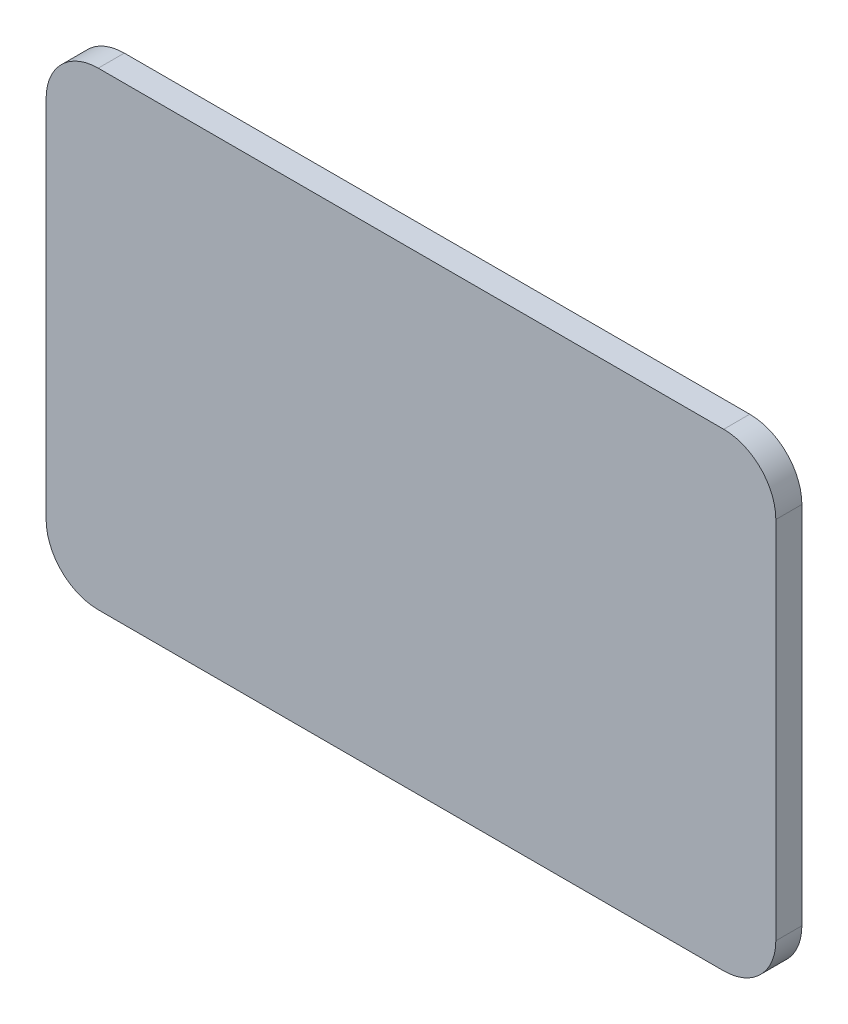
ISO-10303-21;
HEADER;
FILE_DESCRIPTION(('STEP AP214'),'2;1');
FILE_NAME('part.step','',(''),(''),'','','');
FILE_SCHEMA(('AUTOMOTIVE_DESIGN { 1 0 10303 214 1 1 1 1 }'));
ENDSEC;
DATA;
#1=APPLICATION_CONTEXT('core data for automotive mechanical design processes');
#2=APPLICATION_PROTOCOL_DEFINITION('international standard','automotive_design',2000,#1);
#3=PRODUCT_CONTEXT('',#1,'mechanical');
#4=PRODUCT('Part','Part','',(#3));
#5=PRODUCT_RELATED_PRODUCT_CATEGORY('part','',(#4));
#6=PRODUCT_DEFINITION_FORMATION('','',#4);
#7=PRODUCT_DEFINITION_CONTEXT('part definition',#1,'design');
#8=PRODUCT_DEFINITION('design','',#6,#7);
#9=PRODUCT_DEFINITION_SHAPE('','',#8);
#10=(LENGTH_UNIT() NAMED_UNIT(*) SI_UNIT(.MILLI.,.METRE.));
#11=(NAMED_UNIT(*) PLANE_ANGLE_UNIT() SI_UNIT($,.RADIAN.));
#12=(NAMED_UNIT(*) SI_UNIT($,.STERADIAN.) SOLID_ANGLE_UNIT());
#13=UNCERTAINTY_MEASURE_WITH_UNIT(LENGTH_MEASURE(1.E-05),#10,'distance_accuracy_value','');
#14=(GEOMETRIC_REPRESENTATION_CONTEXT(3) GLOBAL_UNCERTAINTY_ASSIGNED_CONTEXT((#13)) GLOBAL_UNIT_ASSIGNED_CONTEXT((#10,
#11,#12)) REPRESENTATION_CONTEXT('',''));
#15=CARTESIAN_POINT('',(0.,0.,0.));
#16=DIRECTION('',(0.,0.,1.));
#17=DIRECTION('',(1.,0.,0.));
#18=AXIS2_PLACEMENT_3D('',#15,#16,#17);
#19=CARTESIAN_POINT('',(-11.3372745805237,-6.87857142857142,1.));
#20=DIRECTION('',(0.,0.,-1.));
#21=DIRECTION('',(-1.,0.,0.));
#22=AXIS2_PLACEMENT_3D('',#19,#20,#21);
#23=CYLINDRICAL_SURFACE('',#22,2.);
#24=CARTESIAN_POINT('',(-11.3372745805237,-6.87857142857142,0.));
#25=DIRECTION('',(0.,0.,1.));
#26=DIRECTION('',(1.,0.,0.));
#27=AXIS2_PLACEMENT_3D('',#24,#25,#26);
#28=CIRCLE('',#27,2.);
#29=CARTESIAN_POINT('',(-13.3372745805237,-6.87857142857141,0.));
#30=VERTEX_POINT('',#29);
#31=CARTESIAN_POINT('',(-11.3372745805237,-8.87857142857142,0.));
#32=VERTEX_POINT('',#31);
#33=EDGE_CURVE('E135',#30,#32,#28,.T.);
#34=ORIENTED_EDGE('',*,*,#33,.T.);
#35=DIRECTION('',(0.,0.,-1.));
#36=VECTOR('',#35,1.);
#37=CARTESIAN_POINT('',(-11.3372745805237,-8.87857142857142,1.));
#38=LINE('',#37,#36);
#39=CARTESIAN_POINT('',(-11.3372745805237,-8.87857142857142,1.));
#40=VERTEX_POINT('',#39);
#41=EDGE_CURVE('E11',#40,#32,#38,.T.);
#42=ORIENTED_EDGE('',*,*,#41,.F.);
#43=CARTESIAN_POINT('',(-11.3372745805237,-6.87857142857142,1.));
#44=DIRECTION('',(0.,0.,1.));
#45=DIRECTION('',(1.,0.,0.));
#46=AXIS2_PLACEMENT_3D('',#43,#44,#45);
#47=CIRCLE('',#46,2.);
#48=CARTESIAN_POINT('',(-13.3372745805237,-6.87857142857141,1.));
#49=VERTEX_POINT('',#48);
#50=EDGE_CURVE('E149',#49,#40,#47,.T.);
#51=ORIENTED_EDGE('',*,*,#50,.F.);
#52=DIRECTION('',(0.,0.,-1.));
#53=VECTOR('',#52,1.);
#54=CARTESIAN_POINT('',(-13.3372745805237,-6.87857142857141,1.));
#55=LINE('',#54,#53);
#56=EDGE_CURVE('E131',#49,#30,#55,.T.);
#57=ORIENTED_EDGE('',*,*,#56,.T.);
#58=EDGE_LOOP('',(#34,#42,#51,#57));
#59=FACE_BOUND('',#58,.T.);
#60=ADVANCED_FACE('F39',(#59),#23,.T.);
#61=CARTESIAN_POINT('',(-11.3372745805237,-8.87857142857142,1.));
#62=DIRECTION('',(0.,1.,0.));
#63=DIRECTION('',(0.,0.,1.));
#64=AXIS2_PLACEMENT_3D('',#61,#62,#63);
#65=PLANE('',#64);
#66=DIRECTION('',(1.,0.,0.));
#67=VECTOR('',#66,1.);
#68=CARTESIAN_POINT('',(-11.3372745805237,-8.87857142857142,0.));
#69=LINE('',#68,#67);
#70=CARTESIAN_POINT('',(12.6627254194763,-8.87857142857142,0.));
#71=VERTEX_POINT('',#70);
#72=EDGE_CURVE('E138',#32,#71,#69,.T.);
#73=ORIENTED_EDGE('',*,*,#72,.T.);
#74=DIRECTION('',(0.,0.,-1.));
#75=VECTOR('',#74,1.);
#76=CARTESIAN_POINT('',(12.6627254194763,-8.87857142857142,1.));
#77=LINE('',#76,#75);
#78=CARTESIAN_POINT('',(12.6627254194763,-8.87857142857142,1.));
#79=VERTEX_POINT('',#78);
#80=EDGE_CURVE('E47',#79,#71,#77,.T.);
#81=ORIENTED_EDGE('',*,*,#80,.F.);
#82=DIRECTION('',(1.,0.,0.));
#83=VECTOR('',#82,1.);
#84=CARTESIAN_POINT('',(-11.3372745805237,-8.87857142857142,1.));
#85=LINE('',#84,#83);
#86=EDGE_CURVE('E98',#40,#79,#85,.T.);
#87=ORIENTED_EDGE('',*,*,#86,.F.);
#88=ORIENTED_EDGE('',*,*,#41,.T.);
#89=EDGE_LOOP('',(#73,#81,#87,#88));
#90=FACE_BOUND('',#89,.T.);
#91=ADVANCED_FACE('F184',(#90),#65,.F.);
#92=CARTESIAN_POINT('',(12.6627254194763,-6.87857142857142,1.));
#93=DIRECTION('',(0.,0.,-1.));
#94=DIRECTION('',(-1.,0.,0.));
#95=AXIS2_PLACEMENT_3D('',#92,#93,#94);
#96=CYLINDRICAL_SURFACE('',#95,2.);
#97=CARTESIAN_POINT('',(12.6627254194763,-6.87857142857142,0.));
#98=DIRECTION('',(0.,0.,1.));
#99=DIRECTION('',(1.,0.,0.));
#100=AXIS2_PLACEMENT_3D('',#97,#98,#99);
#101=CIRCLE('',#100,2.);
#102=CARTESIAN_POINT('',(14.6627254194763,-6.87857142857142,0.));
#103=VERTEX_POINT('',#102);
#104=EDGE_CURVE('E140',#71,#103,#101,.T.);
#105=ORIENTED_EDGE('',*,*,#104,.T.);
#106=DIRECTION('',(0.,0.,-1.));
#107=VECTOR('',#106,1.);
#108=CARTESIAN_POINT('',(14.6627254194763,-6.87857142857142,1.));
#109=LINE('',#108,#107);
#110=CARTESIAN_POINT('',(14.6627254194763,-6.87857142857142,1.));
#111=VERTEX_POINT('',#110);
#112=EDGE_CURVE('E156',#111,#103,#109,.T.);
#113=ORIENTED_EDGE('',*,*,#112,.F.);
#114=CARTESIAN_POINT('',(12.6627254194763,-6.87857142857142,1.));
#115=DIRECTION('',(0.,0.,1.));
#116=DIRECTION('',(1.,0.,0.));
#117=AXIS2_PLACEMENT_3D('',#114,#115,#116);
#118=CIRCLE('',#117,2.);
#119=EDGE_CURVE('E164',#79,#111,#118,.T.);
#120=ORIENTED_EDGE('',*,*,#119,.F.);
#121=ORIENTED_EDGE('',*,*,#80,.T.);
#122=EDGE_LOOP('',(#105,#113,#120,#121));
#123=FACE_BOUND('',#122,.T.);
#124=ADVANCED_FACE('F162',(#123),#96,.T.);
#125=CARTESIAN_POINT('',(14.6627254194763,-6.87857142857142,1.));
#126=DIRECTION('',(-1.,0.,0.));
#127=DIRECTION('',(0.,0.,1.));
#128=AXIS2_PLACEMENT_3D('',#125,#126,#127);
#129=PLANE('',#128);
#130=DIRECTION('',(0.,1.,0.));
#131=VECTOR('',#130,1.);
#132=CARTESIAN_POINT('',(14.6627254194763,-6.87857142857142,0.));
#133=LINE('',#132,#131);
#134=CARTESIAN_POINT('',(14.6627254194763,7.12142857142856,0.));
#135=VERTEX_POINT('',#134);
#136=EDGE_CURVE('E142',#103,#135,#133,.T.);
#137=ORIENTED_EDGE('',*,*,#136,.T.);
#138=DIRECTION('',(0.,0.,-1.));
#139=VECTOR('',#138,1.);
#140=CARTESIAN_POINT('',(14.6627254194763,7.12142857142856,1.));
#141=LINE('',#140,#139);
#142=CARTESIAN_POINT('',(14.6627254194763,7.12142857142856,1.));
#143=VERTEX_POINT('',#142);
#144=EDGE_CURVE('E153',#143,#135,#141,.T.);
#145=ORIENTED_EDGE('',*,*,#144,.F.);
#146=DIRECTION('',(0.,1.,0.));
#147=VECTOR('',#146,1.);
#148=CARTESIAN_POINT('',(14.6627254194763,-6.87857142857142,1.));
#149=LINE('',#148,#147);
#150=EDGE_CURVE('E176',#111,#143,#149,.T.);
#151=ORIENTED_EDGE('',*,*,#150,.F.);
#152=ORIENTED_EDGE('',*,*,#112,.T.);
#153=EDGE_LOOP('',(#137,#145,#151,#152));
#154=FACE_BOUND('',#153,.T.);
#155=ADVANCED_FACE('F172',(#154),#129,.F.);
#156=CARTESIAN_POINT('',(12.6627254194763,7.12142857142858,1.));
#157=DIRECTION('',(0.,0.,-1.));
#158=DIRECTION('',(-1.,0.,0.));
#159=AXIS2_PLACEMENT_3D('',#156,#157,#158);
#160=CYLINDRICAL_SURFACE('',#159,2.);
#161=CARTESIAN_POINT('',(12.6627254194763,7.12142857142858,0.));
#162=DIRECTION('',(0.,0.,1.));
#163=DIRECTION('',(1.,0.,0.));
#164=AXIS2_PLACEMENT_3D('',#161,#162,#163);
#165=CIRCLE('',#164,2.);
#166=CARTESIAN_POINT('',(12.6627254194763,9.12142857142858,0.));
#167=VERTEX_POINT('',#166);
#168=EDGE_CURVE('E144',#135,#167,#165,.T.);
#169=ORIENTED_EDGE('',*,*,#168,.T.);
#170=DIRECTION('',(0.,0.,-1.));
#171=VECTOR('',#170,1.);
#172=CARTESIAN_POINT('',(12.6627254194763,9.12142857142858,1.));
#173=LINE('',#172,#171);
#174=CARTESIAN_POINT('',(12.6627254194763,9.12142857142858,1.));
#175=VERTEX_POINT('',#174);
#176=EDGE_CURVE('E126',#175,#167,#173,.T.);
#177=ORIENTED_EDGE('',*,*,#176,.F.);
#178=CARTESIAN_POINT('',(12.6627254194763,7.12142857142858,1.));
#179=DIRECTION('',(0.,0.,1.));
#180=DIRECTION('',(1.,0.,0.));
#181=AXIS2_PLACEMENT_3D('',#178,#179,#180);
#182=CIRCLE('',#181,2.);
#183=EDGE_CURVE('E117',#143,#175,#182,.T.);
#184=ORIENTED_EDGE('',*,*,#183,.F.);
#185=ORIENTED_EDGE('',*,*,#144,.T.);
#186=EDGE_LOOP('',(#169,#177,#184,#185));
#187=FACE_BOUND('',#186,.T.);
#188=ADVANCED_FACE('F175',(#187),#160,.T.);
#189=CARTESIAN_POINT('',(12.6627254194763,9.12142857142858,1.));
#190=DIRECTION('',(0.,-1.,0.));
#191=DIRECTION('',(0.,0.,-1.));
#192=AXIS2_PLACEMENT_3D('',#189,#190,#191);
#193=PLANE('',#192);
#194=DIRECTION('',(-1.,0.,0.));
#195=VECTOR('',#194,1.);
#196=CARTESIAN_POINT('',(12.6627254194763,9.12142857142858,0.));
#197=LINE('',#196,#195);
#198=CARTESIAN_POINT('',(-11.3372745805237,9.12142857142858,0.));
#199=VERTEX_POINT('',#198);
#200=EDGE_CURVE('E125',#167,#199,#197,.T.);
#201=ORIENTED_EDGE('',*,*,#200,.T.);
#202=DIRECTION('',(0.,0.,-1.));
#203=VECTOR('',#202,1.);
#204=CARTESIAN_POINT('',(-11.3372745805237,9.12142857142858,1.));
#205=LINE('',#204,#203);
#206=CARTESIAN_POINT('',(-11.3372745805237,9.12142857142858,1.));
#207=VERTEX_POINT('',#206);
#208=EDGE_CURVE('E122',#207,#199,#205,.T.);
#209=ORIENTED_EDGE('',*,*,#208,.F.);
#210=DIRECTION('',(-1.,0.,0.));
#211=VECTOR('',#210,1.);
#212=CARTESIAN_POINT('',(12.6627254194763,9.12142857142858,1.));
#213=LINE('',#212,#211);
#214=EDGE_CURVE('E111',#175,#207,#213,.T.);
#215=ORIENTED_EDGE('',*,*,#214,.F.);
#216=ORIENTED_EDGE('',*,*,#176,.T.);
#217=EDGE_LOOP('',(#201,#209,#215,#216));
#218=FACE_BOUND('',#217,.T.);
#219=ADVANCED_FACE('F123',(#218),#193,.F.);
#220=CARTESIAN_POINT('',(-11.3372745805237,7.12142857142858,1.));
#221=DIRECTION('',(0.,0.,-1.));
#222=DIRECTION('',(-1.,0.,0.));
#223=AXIS2_PLACEMENT_3D('',#220,#221,#222);
#224=CYLINDRICAL_SURFACE('',#223,2.);
#225=CARTESIAN_POINT('',(-11.3372745805237,7.12142857142858,0.));
#226=DIRECTION('',(0.,0.,1.));
#227=DIRECTION('',(1.,0.,0.));
#228=AXIS2_PLACEMENT_3D('',#225,#226,#227);
#229=CIRCLE('',#228,2.);
#230=CARTESIAN_POINT('',(-13.3372745805237,7.12142857142856,0.));
#231=VERTEX_POINT('',#230);
#232=EDGE_CURVE('E84',#199,#231,#229,.T.);
#233=ORIENTED_EDGE('',*,*,#232,.T.);
#234=DIRECTION('',(0.,0.,-1.));
#235=VECTOR('',#234,1.);
#236=CARTESIAN_POINT('',(-13.3372745805237,7.12142857142856,1.));
#237=LINE('',#236,#235);
#238=CARTESIAN_POINT('',(-13.3372745805237,7.12142857142856,1.));
#239=VERTEX_POINT('',#238);
#240=EDGE_CURVE('E127',#239,#231,#237,.T.);
#241=ORIENTED_EDGE('',*,*,#240,.F.);
#242=CARTESIAN_POINT('',(-11.3372745805237,7.12142857142858,1.));
#243=DIRECTION('',(0.,0.,1.));
#244=DIRECTION('',(1.,0.,0.));
#245=AXIS2_PLACEMENT_3D('',#242,#243,#244);
#246=CIRCLE('',#245,2.);
#247=EDGE_CURVE('E115',#207,#239,#246,.T.);
#248=ORIENTED_EDGE('',*,*,#247,.F.);
#249=ORIENTED_EDGE('',*,*,#208,.T.);
#250=EDGE_LOOP('',(#233,#241,#248,#249));
#251=FACE_BOUND('',#250,.T.);
#252=ADVANCED_FACE('F129',(#251),#224,.T.);
#253=CARTESIAN_POINT('',(-13.3372745805237,7.12142857142856,1.));
#254=DIRECTION('',(1.,0.,0.));
#255=DIRECTION('',(0.,0.,-1.));
#256=AXIS2_PLACEMENT_3D('',#253,#254,#255);
#257=PLANE('',#256);
#258=DIRECTION('',(0.,-1.,0.));
#259=VECTOR('',#258,1.);
#260=CARTESIAN_POINT('',(-13.3372745805237,7.12142857142856,0.));
#261=LINE('',#260,#259);
#262=EDGE_CURVE('E90',#231,#30,#261,.T.);
#263=ORIENTED_EDGE('',*,*,#262,.T.);
#264=ORIENTED_EDGE('',*,*,#56,.F.);
#265=DIRECTION('',(0.,-1.,0.));
#266=VECTOR('',#265,1.);
#267=CARTESIAN_POINT('',(-13.3372745805237,7.12142857142856,1.));
#268=LINE('',#267,#266);
#269=EDGE_CURVE('E55',#239,#49,#268,.T.);
#270=ORIENTED_EDGE('',*,*,#269,.F.);
#271=ORIENTED_EDGE('',*,*,#240,.T.);
#272=EDGE_LOOP('',(#263,#264,#270,#271));
#273=FACE_BOUND('',#272,.T.);
#274=ADVANCED_FACE('F200',(#273),#257,.F.);
#275=CARTESIAN_POINT('',(-11.3372745805237,-6.87857142857142,1.));
#276=DIRECTION('',(0.,0.,1.));
#277=DIRECTION('',(1.,0.,0.));
#278=AXIS2_PLACEMENT_3D('',#275,#276,#277);
#279=PLANE('',#278);
#280=ORIENTED_EDGE('',*,*,#50,.T.);
#281=ORIENTED_EDGE('',*,*,#86,.T.);
#282=ORIENTED_EDGE('',*,*,#119,.T.);
#283=ORIENTED_EDGE('',*,*,#150,.T.);
#284=ORIENTED_EDGE('',*,*,#183,.T.);
#285=ORIENTED_EDGE('',*,*,#214,.T.);
#286=ORIENTED_EDGE('',*,*,#247,.T.);
#287=ORIENTED_EDGE('',*,*,#269,.T.);
#288=EDGE_LOOP('',(#280,#281,#282,#283,#284,#285,#286,#287));
#289=FACE_BOUND('',#288,.T.);
#290=ADVANCED_FACE('F113',(#289),#279,.T.);
#291=CARTESIAN_POINT('',(-11.3372745805237,-6.87857142857142,0.));
#292=DIRECTION('',(0.,0.,1.));
#293=DIRECTION('',(1.,0.,0.));
#294=AXIS2_PLACEMENT_3D('',#291,#292,#293);
#295=PLANE('',#294);
#296=ORIENTED_EDGE('',*,*,#33,.F.);
#297=ORIENTED_EDGE('',*,*,#262,.F.);
#298=ORIENTED_EDGE('',*,*,#232,.F.);
#299=ORIENTED_EDGE('',*,*,#200,.F.);
#300=ORIENTED_EDGE('',*,*,#168,.F.);
#301=ORIENTED_EDGE('',*,*,#136,.F.);
#302=ORIENTED_EDGE('',*,*,#104,.F.);
#303=ORIENTED_EDGE('',*,*,#72,.F.);
#304=EDGE_LOOP('',(#296,#297,#298,#299,#300,#301,#302,#303));
#305=FACE_BOUND('',#304,.T.);
#306=ADVANCED_FACE('F168',(#305),#295,.F.);
#307=CLOSED_SHELL('',(#60,#91,#124,#155,#188,#219,#252,#274,#290,#306));
#308=MANIFOLD_SOLID_BREP('B2',#307);
#309=ADVANCED_BREP_SHAPE_REPRESENTATION('',(#18,#308),#14);
#310=SHAPE_DEFINITION_REPRESENTATION(#9,#309);
ENDSEC;
END-ISO-10303-21;
